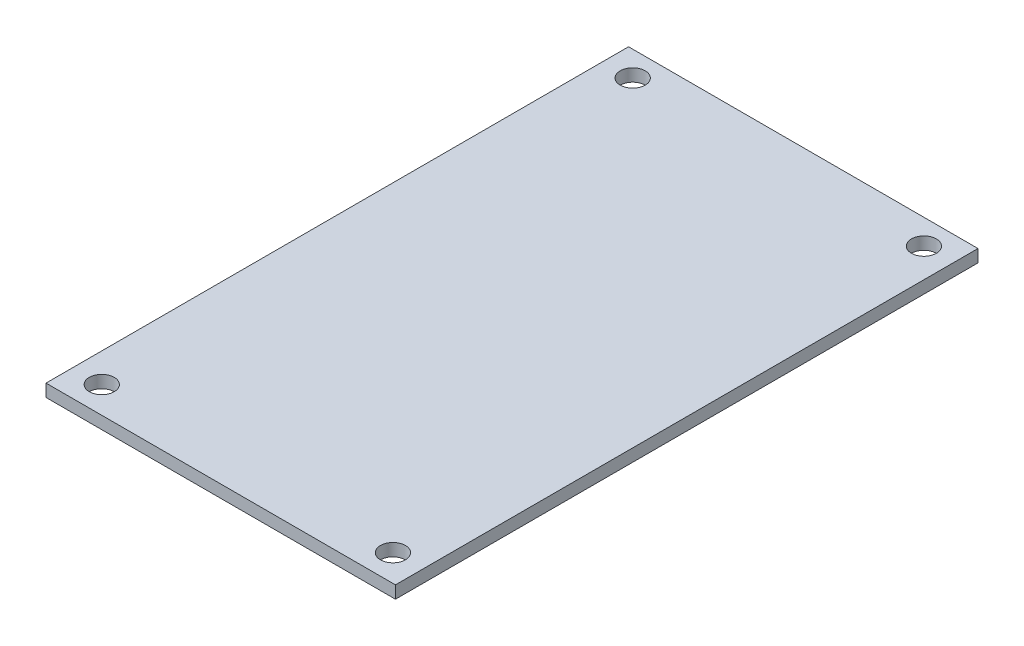
ISO-10303-21;
HEADER;
FILE_DESCRIPTION(('STEP AP214'),'2;1');
FILE_NAME('part.step','',(''),(''),'','','');
FILE_SCHEMA(('AUTOMOTIVE_DESIGN { 1 0 10303 214 1 1 1 1 }'));
ENDSEC;
DATA;
#1=APPLICATION_CONTEXT('core data for automotive mechanical design processes');
#2=APPLICATION_PROTOCOL_DEFINITION('international standard','automotive_design',2000,#1);
#3=PRODUCT_CONTEXT('',#1,'mechanical');
#4=PRODUCT('Part','Part','',(#3));
#5=PRODUCT_RELATED_PRODUCT_CATEGORY('part','',(#4));
#6=PRODUCT_DEFINITION_FORMATION('','',#4);
#7=PRODUCT_DEFINITION_CONTEXT('part definition',#1,'design');
#8=PRODUCT_DEFINITION('design','',#6,#7);
#9=PRODUCT_DEFINITION_SHAPE('','',#8);
#10=(LENGTH_UNIT() NAMED_UNIT(*) SI_UNIT(.MILLI.,.METRE.));
#11=(NAMED_UNIT(*) PLANE_ANGLE_UNIT() SI_UNIT($,.RADIAN.));
#12=(NAMED_UNIT(*) SI_UNIT($,.STERADIAN.) SOLID_ANGLE_UNIT());
#13=UNCERTAINTY_MEASURE_WITH_UNIT(LENGTH_MEASURE(1.E-05),#10,'distance_accuracy_value','');
#14=(GEOMETRIC_REPRESENTATION_CONTEXT(3) GLOBAL_UNCERTAINTY_ASSIGNED_CONTEXT((#13)) GLOBAL_UNIT_ASSIGNED_CONTEXT((#10,
#11,#12)) REPRESENTATION_CONTEXT('',''));
#15=CARTESIAN_POINT('',(0.,0.,0.));
#16=DIRECTION('',(0.,0.,1.));
#17=DIRECTION('',(1.,0.,0.));
#18=AXIS2_PLACEMENT_3D('',#15,#16,#17);
#19=CARTESIAN_POINT('',(0.,1.5,0.));
#20=DIRECTION('',(0.,-1.,0.));
#21=DIRECTION('',(0.,0.,-1.));
#22=AXIS2_PLACEMENT_3D('',#19,#20,#21);
#23=PLANE('',#22);
#24=DIRECTION('',(0.,0.,1.));
#25=VECTOR('',#24,1.);
#26=CARTESIAN_POINT('',(0.,1.5,0.));
#27=LINE('',#26,#25);
#28=CARTESIAN_POINT('',(0.,1.5,-70.0156339108165));
#29=VERTEX_POINT('',#28);
#30=CARTESIAN_POINT('',(0.,1.5,0.));
#31=VERTEX_POINT('',#30);
#32=EDGE_CURVE('E84',#29,#31,#27,.T.);
#33=ORIENTED_EDGE('',*,*,#32,.T.);
#34=DIRECTION('',(1.,0.,0.));
#35=VECTOR('',#34,1.);
#36=CARTESIAN_POINT('',(0.,1.5,0.));
#37=LINE('',#36,#35);
#38=CARTESIAN_POINT('',(42.,1.5,0.));
#39=VERTEX_POINT('',#38);
#40=EDGE_CURVE('E79',#31,#39,#37,.T.);
#41=ORIENTED_EDGE('',*,*,#40,.T.);
#42=DIRECTION('',(0.,0.,-1.));
#43=VECTOR('',#42,1.);
#44=CARTESIAN_POINT('',(42.,1.5,0.));
#45=LINE('',#44,#43);
#46=CARTESIAN_POINT('',(42.,1.5,-70.0156339108165));
#47=VERTEX_POINT('',#46);
#48=EDGE_CURVE('E82',#39,#47,#45,.T.);
#49=ORIENTED_EDGE('',*,*,#48,.T.);
#50=DIRECTION('',(-1.,0.,0.));
#51=VECTOR('',#50,1.);
#52=CARTESIAN_POINT('',(0.,1.5,-70.0156339108165));
#53=LINE('',#52,#51);
#54=EDGE_CURVE('E49',#47,#29,#53,.T.);
#55=ORIENTED_EDGE('',*,*,#54,.T.);
#56=EDGE_LOOP('',(#33,#41,#49,#55));
#57=FACE_BOUND('',#56,.T.);
#58=CARTESIAN_POINT('',(3.5,1.5,-67.0156339108165));
#59=DIRECTION('',(0.,1.,0.));
#60=DIRECTION('',(0.,0.,1.));
#61=AXIS2_PLACEMENT_3D('',#58,#59,#60);
#62=CIRCLE('',#61,1.5);
#63=CARTESIAN_POINT('',(3.5,1.5,-65.5156339108165));
#64=VERTEX_POINT('',#63);
#65=EDGE_CURVE('E99',#64,#64,#62,.T.);
#66=ORIENTED_EDGE('',*,*,#65,.F.);
#67=EDGE_LOOP('',(#66));
#68=FACE_BOUND('',#67,.T.);
#69=CARTESIAN_POINT('',(38.5,1.5,-67.0156339108165));
#70=DIRECTION('',(0.,1.,0.));
#71=DIRECTION('',(0.,0.,1.));
#72=AXIS2_PLACEMENT_3D('',#69,#70,#71);
#73=CIRCLE('',#72,1.5);
#74=CARTESIAN_POINT('',(38.5,1.5,-65.5156339108165));
#75=VERTEX_POINT('',#74);
#76=EDGE_CURVE('E114',#75,#75,#73,.T.);
#77=ORIENTED_EDGE('',*,*,#76,.F.);
#78=EDGE_LOOP('',(#77));
#79=FACE_BOUND('',#78,.T.);
#80=CARTESIAN_POINT('',(38.4999999999995,1.5,-3.19999999999627));
#81=DIRECTION('',(0.,1.,0.));
#82=DIRECTION('',(0.,0.,1.));
#83=AXIS2_PLACEMENT_3D('',#80,#81,#82);
#84=CIRCLE('',#83,1.5);
#85=CARTESIAN_POINT('',(38.4999999999995,1.5,-1.69999999999627));
#86=VERTEX_POINT('',#85);
#87=EDGE_CURVE('E120',#86,#86,#84,.T.);
#88=ORIENTED_EDGE('',*,*,#87,.F.);
#89=EDGE_LOOP('',(#88));
#90=FACE_BOUND('',#89,.T.);
#91=CARTESIAN_POINT('',(3.50000000000125,1.5,-3.19999999999627));
#92=DIRECTION('',(0.,1.,0.));
#93=DIRECTION('',(0.,0.,1.));
#94=AXIS2_PLACEMENT_3D('',#91,#92,#93);
#95=CIRCLE('',#94,1.5);
#96=CARTESIAN_POINT('',(3.50000000000125,1.5,-1.69999999999627));
#97=VERTEX_POINT('',#96);
#98=EDGE_CURVE('E126',#97,#97,#95,.T.);
#99=ORIENTED_EDGE('',*,*,#98,.F.);
#100=EDGE_LOOP('',(#99));
#101=FACE_BOUND('',#100,.T.);
#102=ADVANCED_FACE('F32',(#57,#68,#79,#90,#101),#23,.F.);
#103=CARTESIAN_POINT('',(0.,0.,0.));
#104=DIRECTION('',(0.,-1.,0.));
#105=DIRECTION('',(0.,0.,-1.));
#106=AXIS2_PLACEMENT_3D('',#103,#104,#105);
#107=PLANE('',#106);
#108=CARTESIAN_POINT('',(38.4999999999995,0.,-3.19999999999627));
#109=DIRECTION('',(0.,1.,0.));
#110=DIRECTION('',(0.,0.,1.));
#111=AXIS2_PLACEMENT_3D('',#108,#109,#110);
#112=CIRCLE('',#111,1.5);
#113=CARTESIAN_POINT('',(38.4999999999995,0.,-1.69999999999627));
#114=VERTEX_POINT('',#113);
#115=EDGE_CURVE('E123',#114,#114,#112,.T.);
#116=ORIENTED_EDGE('',*,*,#115,.T.);
#117=EDGE_LOOP('',(#116));
#118=FACE_BOUND('',#117,.T.);
#119=CARTESIAN_POINT('',(3.5,0.,-67.0156339108165));
#120=DIRECTION('',(0.,1.,0.));
#121=DIRECTION('',(0.,0.,1.));
#122=AXIS2_PLACEMENT_3D('',#119,#120,#121);
#123=CIRCLE('',#122,1.5);
#124=CARTESIAN_POINT('',(3.5,0.,-65.5156339108165));
#125=VERTEX_POINT('',#124);
#126=EDGE_CURVE('E111',#125,#125,#123,.T.);
#127=ORIENTED_EDGE('',*,*,#126,.T.);
#128=EDGE_LOOP('',(#127));
#129=FACE_BOUND('',#128,.T.);
#130=DIRECTION('',(0.,0.,1.));
#131=VECTOR('',#130,1.);
#132=CARTESIAN_POINT('',(0.,0.,0.));
#133=LINE('',#132,#131);
#134=CARTESIAN_POINT('',(0.,0.,-70.0156339108165));
#135=VERTEX_POINT('',#134);
#136=CARTESIAN_POINT('',(0.,0.,0.));
#137=VERTEX_POINT('',#136);
#138=EDGE_CURVE('E96',#135,#137,#133,.T.);
#139=ORIENTED_EDGE('',*,*,#138,.F.);
#140=DIRECTION('',(-1.,0.,0.));
#141=VECTOR('',#140,1.);
#142=CARTESIAN_POINT('',(0.,0.,-70.0156339108165));
#143=LINE('',#142,#141);
#144=CARTESIAN_POINT('',(42.,0.,-70.0156339108165));
#145=VERTEX_POINT('',#144);
#146=EDGE_CURVE('E72',#145,#135,#143,.T.);
#147=ORIENTED_EDGE('',*,*,#146,.F.);
#148=DIRECTION('',(0.,0.,-1.));
#149=VECTOR('',#148,1.);
#150=CARTESIAN_POINT('',(42.,0.,0.));
#151=LINE('',#150,#149);
#152=CARTESIAN_POINT('',(42.,0.,0.));
#153=VERTEX_POINT('',#152);
#154=EDGE_CURVE('E66',#153,#145,#151,.T.);
#155=ORIENTED_EDGE('',*,*,#154,.F.);
#156=DIRECTION('',(1.,0.,0.));
#157=VECTOR('',#156,1.);
#158=CARTESIAN_POINT('',(0.,0.,0.));
#159=LINE('',#158,#157);
#160=EDGE_CURVE('E88',#137,#153,#159,.T.);
#161=ORIENTED_EDGE('',*,*,#160,.F.);
#162=EDGE_LOOP('',(#139,#147,#155,#161));
#163=FACE_BOUND('',#162,.T.);
#164=CARTESIAN_POINT('',(38.5,0.,-67.0156339108165));
#165=DIRECTION('',(0.,1.,0.));
#166=DIRECTION('',(0.,0.,1.));
#167=AXIS2_PLACEMENT_3D('',#164,#165,#166);
#168=CIRCLE('',#167,1.5);
#169=CARTESIAN_POINT('',(38.5,0.,-65.5156339108165));
#170=VERTEX_POINT('',#169);
#171=EDGE_CURVE('E117',#170,#170,#168,.T.);
#172=ORIENTED_EDGE('',*,*,#171,.T.);
#173=EDGE_LOOP('',(#172));
#174=FACE_BOUND('',#173,.T.);
#175=CARTESIAN_POINT('',(3.50000000000125,0.,-3.19999999999627));
#176=DIRECTION('',(0.,1.,0.));
#177=DIRECTION('',(0.,0.,1.));
#178=AXIS2_PLACEMENT_3D('',#175,#176,#177);
#179=CIRCLE('',#178,1.5);
#180=CARTESIAN_POINT('',(3.50000000000125,0.,-1.69999999999627));
#181=VERTEX_POINT('',#180);
#182=EDGE_CURVE('E129',#181,#181,#179,.T.);
#183=ORIENTED_EDGE('',*,*,#182,.T.);
#184=EDGE_LOOP('',(#183));
#185=FACE_BOUND('',#184,.T.);
#186=ADVANCED_FACE('F107',(#118,#129,#163,#174,#185),#107,.T.);
#187=CARTESIAN_POINT('',(0.,1.5,0.));
#188=DIRECTION('',(1.,0.,0.));
#189=DIRECTION('',(0.,0.,-1.));
#190=AXIS2_PLACEMENT_3D('',#187,#188,#189);
#191=PLANE('',#190);
#192=ORIENTED_EDGE('',*,*,#138,.T.);
#193=DIRECTION('',(0.,-1.,0.));
#194=VECTOR('',#193,1.);
#195=CARTESIAN_POINT('',(0.,1.5,0.));
#196=LINE('',#195,#194);
#197=EDGE_CURVE('E11',#31,#137,#196,.T.);
#198=ORIENTED_EDGE('',*,*,#197,.F.);
#199=ORIENTED_EDGE('',*,*,#32,.F.);
#200=DIRECTION('',(0.,-1.,0.));
#201=VECTOR('',#200,1.);
#202=CARTESIAN_POINT('',(0.,1.5,-70.0156339108165));
#203=LINE('',#202,#201);
#204=EDGE_CURVE('E92',#29,#135,#203,.T.);
#205=ORIENTED_EDGE('',*,*,#204,.T.);
#206=EDGE_LOOP('',(#192,#198,#199,#205));
#207=FACE_BOUND('',#206,.T.);
#208=ADVANCED_FACE('F34',(#207),#191,.F.);
#209=CARTESIAN_POINT('',(0.,1.5,0.));
#210=DIRECTION('',(0.,0.,-1.));
#211=DIRECTION('',(-1.,0.,0.));
#212=AXIS2_PLACEMENT_3D('',#209,#210,#211);
#213=PLANE('',#212);
#214=ORIENTED_EDGE('',*,*,#160,.T.);
#215=DIRECTION('',(0.,-1.,0.));
#216=VECTOR('',#215,1.);
#217=CARTESIAN_POINT('',(42.,1.5,0.));
#218=LINE('',#217,#216);
#219=EDGE_CURVE('E41',#39,#153,#218,.T.);
#220=ORIENTED_EDGE('',*,*,#219,.F.);
#221=ORIENTED_EDGE('',*,*,#40,.F.);
#222=ORIENTED_EDGE('',*,*,#197,.T.);
#223=EDGE_LOOP('',(#214,#220,#221,#222));
#224=FACE_BOUND('',#223,.T.);
#225=ADVANCED_FACE('F87',(#224),#213,.F.);
#226=CARTESIAN_POINT('',(42.,1.5,0.));
#227=DIRECTION('',(-1.,0.,0.));
#228=DIRECTION('',(0.,0.,1.));
#229=AXIS2_PLACEMENT_3D('',#226,#227,#228);
#230=PLANE('',#229);
#231=ORIENTED_EDGE('',*,*,#154,.T.);
#232=DIRECTION('',(0.,-1.,0.));
#233=VECTOR('',#232,1.);
#234=CARTESIAN_POINT('',(42.,1.5,-70.0156339108165));
#235=LINE('',#234,#233);
#236=EDGE_CURVE('E89',#47,#145,#235,.T.);
#237=ORIENTED_EDGE('',*,*,#236,.F.);
#238=ORIENTED_EDGE('',*,*,#48,.F.);
#239=ORIENTED_EDGE('',*,*,#219,.T.);
#240=EDGE_LOOP('',(#231,#237,#238,#239));
#241=FACE_BOUND('',#240,.T.);
#242=ADVANCED_FACE('F90',(#241),#230,.F.);
#243=CARTESIAN_POINT('',(0.,1.5,-70.0156339108165));
#244=DIRECTION('',(0.,0.,1.));
#245=DIRECTION('',(1.,0.,0.));
#246=AXIS2_PLACEMENT_3D('',#243,#244,#245);
#247=PLANE('',#246);
#248=ORIENTED_EDGE('',*,*,#146,.T.);
#249=ORIENTED_EDGE('',*,*,#204,.F.);
#250=ORIENTED_EDGE('',*,*,#54,.F.);
#251=ORIENTED_EDGE('',*,*,#236,.T.);
#252=EDGE_LOOP('',(#248,#249,#250,#251));
#253=FACE_BOUND('',#252,.T.);
#254=ADVANCED_FACE('F104',(#253),#247,.F.);
#255=CARTESIAN_POINT('',(3.5,1.5,-67.0156339108165));
#256=DIRECTION('',(0.,-1.,0.));
#257=DIRECTION('',(0.,0.,-1.));
#258=AXIS2_PLACEMENT_3D('',#255,#256,#257);
#259=CYLINDRICAL_SURFACE('',#258,1.5);
#260=ORIENTED_EDGE('',*,*,#65,.T.);
#261=EDGE_LOOP('',(#260));
#262=FACE_BOUND('',#261,.T.);
#263=ORIENTED_EDGE('',*,*,#126,.F.);
#264=EDGE_LOOP('',(#263));
#265=FACE_BOUND('',#264,.T.);
#266=ADVANCED_FACE('F146',(#262,#265),#259,.F.);
#267=CARTESIAN_POINT('',(38.5,1.5,-67.0156339108165));
#268=DIRECTION('',(0.,-1.,0.));
#269=DIRECTION('',(0.,0.,-1.));
#270=AXIS2_PLACEMENT_3D('',#267,#268,#269);
#271=CYLINDRICAL_SURFACE('',#270,1.5);
#272=ORIENTED_EDGE('',*,*,#76,.T.);
#273=EDGE_LOOP('',(#272));
#274=FACE_BOUND('',#273,.T.);
#275=ORIENTED_EDGE('',*,*,#171,.F.);
#276=EDGE_LOOP('',(#275));
#277=FACE_BOUND('',#276,.T.);
#278=ADVANCED_FACE('F192',(#274,#277),#271,.F.);
#279=CARTESIAN_POINT('',(38.4999999999995,1.5,-3.19999999999627));
#280=DIRECTION('',(0.,-1.,0.));
#281=DIRECTION('',(0.,0.,-1.));
#282=AXIS2_PLACEMENT_3D('',#279,#280,#281);
#283=CYLINDRICAL_SURFACE('',#282,1.5);
#284=ORIENTED_EDGE('',*,*,#87,.T.);
#285=EDGE_LOOP('',(#284));
#286=FACE_BOUND('',#285,.T.);
#287=ORIENTED_EDGE('',*,*,#115,.F.);
#288=EDGE_LOOP('',(#287));
#289=FACE_BOUND('',#288,.T.);
#290=ADVANCED_FACE('F200',(#286,#289),#283,.F.);
#291=CARTESIAN_POINT('',(3.50000000000125,1.5,-3.19999999999627));
#292=DIRECTION('',(0.,-1.,0.));
#293=DIRECTION('',(0.,0.,-1.));
#294=AXIS2_PLACEMENT_3D('',#291,#292,#293);
#295=CYLINDRICAL_SURFACE('',#294,1.5);
#296=ORIENTED_EDGE('',*,*,#98,.T.);
#297=EDGE_LOOP('',(#296));
#298=FACE_BOUND('',#297,.T.);
#299=ORIENTED_EDGE('',*,*,#182,.F.);
#300=EDGE_LOOP('',(#299));
#301=FACE_BOUND('',#300,.T.);
#302=ADVANCED_FACE('F135',(#298,#301),#295,.F.);
#303=CLOSED_SHELL('',(#102,#186,#208,#225,#242,#254,#266,#278,#290,#302));
#304=MANIFOLD_SOLID_BREP('B2',#303);
#305=ADVANCED_BREP_SHAPE_REPRESENTATION('',(#18,#304),#14);
#306=SHAPE_DEFINITION_REPRESENTATION(#9,#305);
ENDSEC;
END-ISO-10303-21;
